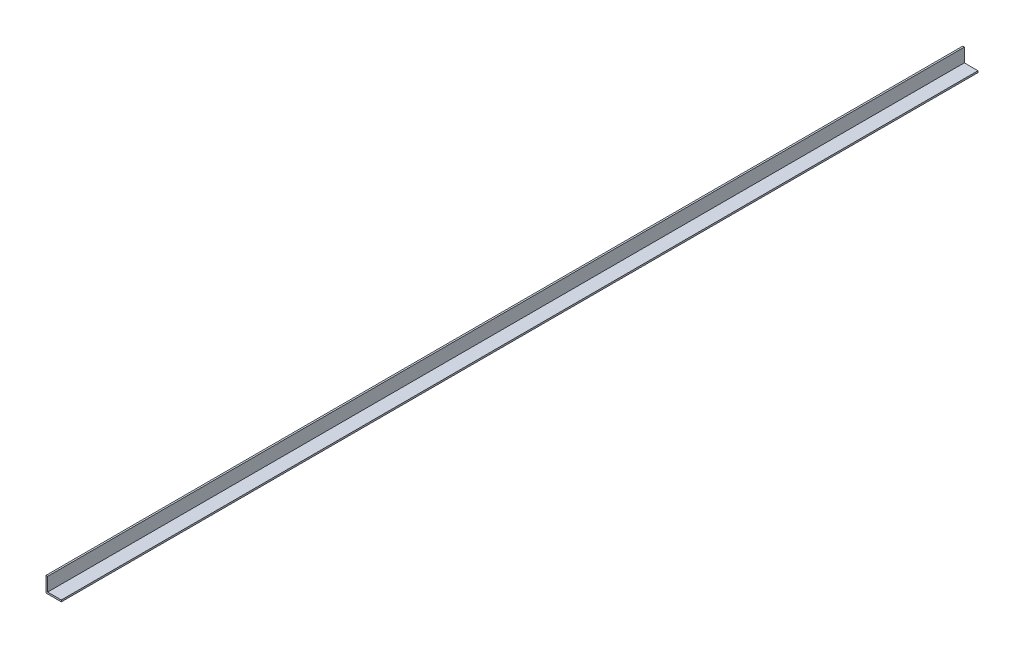
ISO-10303-21;
HEADER;
FILE_DESCRIPTION(('STEP AP214'),'2;1');
FILE_NAME('part.step','',(''),(''),'','','');
FILE_SCHEMA(('AUTOMOTIVE_DESIGN { 1 0 10303 214 1 1 1 1 }'));
ENDSEC;
DATA;
#1=APPLICATION_CONTEXT('core data for automotive mechanical design processes');
#2=APPLICATION_PROTOCOL_DEFINITION('international standard','automotive_design',2000,#1);
#3=PRODUCT_CONTEXT('',#1,'mechanical');
#4=PRODUCT('Part','Part','',(#3));
#5=PRODUCT_RELATED_PRODUCT_CATEGORY('part','',(#4));
#6=PRODUCT_DEFINITION_FORMATION('','',#4);
#7=PRODUCT_DEFINITION_CONTEXT('part definition',#1,'design');
#8=PRODUCT_DEFINITION('design','',#6,#7);
#9=PRODUCT_DEFINITION_SHAPE('','',#8);
#10=(LENGTH_UNIT() NAMED_UNIT(*) SI_UNIT(.MILLI.,.METRE.));
#11=(NAMED_UNIT(*) PLANE_ANGLE_UNIT() SI_UNIT($,.RADIAN.));
#12=(NAMED_UNIT(*) SI_UNIT($,.STERADIAN.) SOLID_ANGLE_UNIT());
#13=UNCERTAINTY_MEASURE_WITH_UNIT(LENGTH_MEASURE(1.E-05),#10,'distance_accuracy_value','');
#14=(GEOMETRIC_REPRESENTATION_CONTEXT(3) GLOBAL_UNCERTAINTY_ASSIGNED_CONTEXT((#13)) GLOBAL_UNIT_ASSIGNED_CONTEXT((#10,
#11,#12)) REPRESENTATION_CONTEXT('',''));
#15=CARTESIAN_POINT('',(0.,0.,0.));
#16=DIRECTION('',(0.,0.,1.));
#17=DIRECTION('',(1.,0.,0.));
#18=AXIS2_PLACEMENT_3D('',#15,#16,#17);
#19=CARTESIAN_POINT('',(11.1,102.,-6100.));
#20=DIRECTION('',(0.,1.,0.));
#21=DIRECTION('',(0.,0.,1.));
#22=AXIS2_PLACEMENT_3D('',#19,#20,#21);
#23=PLANE('',#22);
#24=DIRECTION('',(-1.,0.,0.));
#25=VECTOR('',#24,1.);
#26=CARTESIAN_POINT('',(11.1,102.,0.));
#27=LINE('',#26,#25);
#28=CARTESIAN_POINT('',(11.1,102.,0.));
#29=VERTEX_POINT('',#28);
#30=CARTESIAN_POINT('',(0.,102.,0.));
#31=VERTEX_POINT('',#30);
#32=EDGE_CURVE('E118',#29,#31,#27,.T.);
#33=ORIENTED_EDGE('',*,*,#32,.F.);
#34=DIRECTION('',(0.,0.,1.));
#35=VECTOR('',#34,1.);
#36=CARTESIAN_POINT('',(11.1,102.,-6100.));
#37=LINE('',#36,#35);
#38=CARTESIAN_POINT('',(11.1,102.,-6100.));
#39=VERTEX_POINT('',#38);
#40=EDGE_CURVE('E11',#39,#29,#37,.T.);
#41=ORIENTED_EDGE('',*,*,#40,.F.);
#42=DIRECTION('',(-1.,0.,0.));
#43=VECTOR('',#42,1.);
#44=CARTESIAN_POINT('',(11.1,102.,-6100.));
#45=LINE('',#44,#43);
#46=CARTESIAN_POINT('',(0.,102.,-6100.));
#47=VERTEX_POINT('',#46);
#48=EDGE_CURVE('E132',#39,#47,#45,.T.);
#49=ORIENTED_EDGE('',*,*,#48,.T.);
#50=DIRECTION('',(0.,0.,1.));
#51=VECTOR('',#50,1.);
#52=CARTESIAN_POINT('',(0.,102.,-6100.));
#53=LINE('',#52,#51);
#54=EDGE_CURVE('E36',#47,#31,#53,.T.);
#55=ORIENTED_EDGE('',*,*,#54,.T.);
#56=EDGE_LOOP('',(#33,#41,#49,#55));
#57=FACE_BOUND('',#56,.T.);
#58=ADVANCED_FACE('F33',(#57),#23,.T.);
#59=CARTESIAN_POINT('',(11.1,11.1,-6100.));
#60=DIRECTION('',(1.,0.,0.));
#61=DIRECTION('',(0.,1.,0.));
#62=AXIS2_PLACEMENT_3D('',#59,#60,#61);
#63=PLANE('',#62);
#64=DIRECTION('',(0.,1.,0.));
#65=VECTOR('',#64,1.);
#66=CARTESIAN_POINT('',(11.1,11.1,0.));
#67=LINE('',#66,#65);
#68=CARTESIAN_POINT('',(11.1,11.1,0.));
#69=VERTEX_POINT('',#68);
#70=EDGE_CURVE('E130',#69,#29,#67,.T.);
#71=ORIENTED_EDGE('',*,*,#70,.F.);
#72=DIRECTION('',(0.,0.,1.));
#73=VECTOR('',#72,1.);
#74=CARTESIAN_POINT('',(11.1,11.1,-6100.));
#75=LINE('',#74,#73);
#76=CARTESIAN_POINT('',(11.1,11.1,-6100.));
#77=VERTEX_POINT('',#76);
#78=EDGE_CURVE('E42',#77,#69,#75,.T.);
#79=ORIENTED_EDGE('',*,*,#78,.F.);
#80=DIRECTION('',(0.,1.,0.));
#81=VECTOR('',#80,1.);
#82=CARTESIAN_POINT('',(11.1,11.1,-6100.));
#83=LINE('',#82,#81);
#84=EDGE_CURVE('E108',#77,#39,#83,.T.);
#85=ORIENTED_EDGE('',*,*,#84,.T.);
#86=ORIENTED_EDGE('',*,*,#40,.T.);
#87=EDGE_LOOP('',(#71,#79,#85,#86));
#88=FACE_BOUND('',#87,.T.);
#89=ADVANCED_FACE('F140',(#88),#63,.T.);
#90=CARTESIAN_POINT('',(102.,11.1,-6100.));
#91=DIRECTION('',(0.,1.,0.));
#92=DIRECTION('',(-1.,0.,0.));
#93=AXIS2_PLACEMENT_3D('',#90,#91,#92);
#94=PLANE('',#93);
#95=DIRECTION('',(-1.,0.,0.));
#96=VECTOR('',#95,1.);
#97=CARTESIAN_POINT('',(102.,11.1,0.));
#98=LINE('',#97,#96);
#99=CARTESIAN_POINT('',(102.,11.1,0.));
#100=VERTEX_POINT('',#99);
#101=EDGE_CURVE('E95',#100,#69,#98,.T.);
#102=ORIENTED_EDGE('',*,*,#101,.F.);
#103=DIRECTION('',(0.,0.,1.));
#104=VECTOR('',#103,1.);
#105=CARTESIAN_POINT('',(102.,11.1,-6100.));
#106=LINE('',#105,#104);
#107=CARTESIAN_POINT('',(102.,11.1,-6100.));
#108=VERTEX_POINT('',#107);
#109=EDGE_CURVE('E90',#108,#100,#106,.T.);
#110=ORIENTED_EDGE('',*,*,#109,.F.);
#111=DIRECTION('',(-1.,0.,0.));
#112=VECTOR('',#111,1.);
#113=CARTESIAN_POINT('',(102.,11.1,-6100.));
#114=LINE('',#113,#112);
#115=EDGE_CURVE('E93',#108,#77,#114,.T.);
#116=ORIENTED_EDGE('',*,*,#115,.T.);
#117=ORIENTED_EDGE('',*,*,#78,.T.);
#118=EDGE_LOOP('',(#102,#110,#116,#117));
#119=FACE_BOUND('',#118,.T.);
#120=ADVANCED_FACE('F92',(#119),#94,.T.);
#121=CARTESIAN_POINT('',(102.,0.,-6100.));
#122=DIRECTION('',(1.,0.,0.));
#123=DIRECTION('',(0.,0.,-1.));
#124=AXIS2_PLACEMENT_3D('',#121,#122,#123);
#125=PLANE('',#124);
#126=DIRECTION('',(0.,1.,0.));
#127=VECTOR('',#126,1.);
#128=CARTESIAN_POINT('',(102.,0.,0.));
#129=LINE('',#128,#127);
#130=CARTESIAN_POINT('',(102.,0.,0.));
#131=VERTEX_POINT('',#130);
#132=EDGE_CURVE('E127',#131,#100,#129,.T.);
#133=ORIENTED_EDGE('',*,*,#132,.F.);
#134=DIRECTION('',(0.,0.,1.));
#135=VECTOR('',#134,1.);
#136=CARTESIAN_POINT('',(102.,0.,-6100.));
#137=LINE('',#136,#135);
#138=CARTESIAN_POINT('',(102.,0.,-6100.));
#139=VERTEX_POINT('',#138);
#140=EDGE_CURVE('E100',#139,#131,#137,.T.);
#141=ORIENTED_EDGE('',*,*,#140,.F.);
#142=DIRECTION('',(0.,1.,0.));
#143=VECTOR('',#142,1.);
#144=CARTESIAN_POINT('',(102.,0.,-6100.));
#145=LINE('',#144,#143);
#146=EDGE_CURVE('E106',#139,#108,#145,.T.);
#147=ORIENTED_EDGE('',*,*,#146,.T.);
#148=ORIENTED_EDGE('',*,*,#109,.T.);
#149=EDGE_LOOP('',(#133,#141,#147,#148));
#150=FACE_BOUND('',#149,.T.);
#151=ADVANCED_FACE('F110',(#150),#125,.T.);
#152=CARTESIAN_POINT('',(0.,0.,-6100.));
#153=DIRECTION('',(0.,-1.,0.));
#154=DIRECTION('',(0.,0.,-1.));
#155=AXIS2_PLACEMENT_3D('',#152,#153,#154);
#156=PLANE('',#155);
#157=DIRECTION('',(1.,0.,0.));
#158=VECTOR('',#157,1.);
#159=CARTESIAN_POINT('',(0.,0.,0.));
#160=LINE('',#159,#158);
#161=CARTESIAN_POINT('',(0.,0.,0.));
#162=VERTEX_POINT('',#161);
#163=EDGE_CURVE('E124',#162,#131,#160,.T.);
#164=ORIENTED_EDGE('',*,*,#163,.F.);
#165=DIRECTION('',(0.,0.,1.));
#166=VECTOR('',#165,1.);
#167=CARTESIAN_POINT('',(0.,0.,-6100.));
#168=LINE('',#167,#166);
#169=CARTESIAN_POINT('',(0.,0.,-6100.));
#170=VERTEX_POINT('',#169);
#171=EDGE_CURVE('E135',#170,#162,#168,.T.);
#172=ORIENTED_EDGE('',*,*,#171,.F.);
#173=DIRECTION('',(1.,0.,0.));
#174=VECTOR('',#173,1.);
#175=CARTESIAN_POINT('',(0.,0.,-6100.));
#176=LINE('',#175,#174);
#177=EDGE_CURVE('E111',#170,#139,#176,.T.);
#178=ORIENTED_EDGE('',*,*,#177,.T.);
#179=ORIENTED_EDGE('',*,*,#140,.T.);
#180=EDGE_LOOP('',(#164,#172,#178,#179));
#181=FACE_BOUND('',#180,.T.);
#182=ADVANCED_FACE('F153',(#181),#156,.T.);
#183=CARTESIAN_POINT('',(0.,102.,-6100.));
#184=DIRECTION('',(-1.,0.,0.));
#185=DIRECTION('',(0.,-1.,0.));
#186=AXIS2_PLACEMENT_3D('',#183,#184,#185);
#187=PLANE('',#186);
#188=DIRECTION('',(0.,-1.,0.));
#189=VECTOR('',#188,1.);
#190=CARTESIAN_POINT('',(0.,102.,0.));
#191=LINE('',#190,#189);
#192=EDGE_CURVE('E121',#31,#162,#191,.T.);
#193=ORIENTED_EDGE('',*,*,#192,.F.);
#194=ORIENTED_EDGE('',*,*,#54,.F.);
#195=DIRECTION('',(0.,-1.,0.));
#196=VECTOR('',#195,1.);
#197=CARTESIAN_POINT('',(0.,102.,-6100.));
#198=LINE('',#197,#196);
#199=EDGE_CURVE('E113',#47,#170,#198,.T.);
#200=ORIENTED_EDGE('',*,*,#199,.T.);
#201=ORIENTED_EDGE('',*,*,#171,.T.);
#202=EDGE_LOOP('',(#193,#194,#200,#201));
#203=FACE_BOUND('',#202,.T.);
#204=ADVANCED_FACE('F137',(#203),#187,.T.);
#205=CARTESIAN_POINT('',(0.,0.,-6100.));
#206=DIRECTION('',(0.,0.,1.));
#207=DIRECTION('',(1.,0.,0.));
#208=AXIS2_PLACEMENT_3D('',#205,#206,#207);
#209=PLANE('',#208);
#210=ORIENTED_EDGE('',*,*,#48,.F.);
#211=ORIENTED_EDGE('',*,*,#84,.F.);
#212=ORIENTED_EDGE('',*,*,#115,.F.);
#213=ORIENTED_EDGE('',*,*,#146,.F.);
#214=ORIENTED_EDGE('',*,*,#177,.F.);
#215=ORIENTED_EDGE('',*,*,#199,.F.);
#216=EDGE_LOOP('',(#210,#211,#212,#213,#214,#215));
#217=FACE_BOUND('',#216,.T.);
#218=ADVANCED_FACE('F104',(#217),#209,.F.);
#219=CARTESIAN_POINT('',(0.,0.,0.));
#220=DIRECTION('',(0.,0.,1.));
#221=DIRECTION('',(1.,0.,0.));
#222=AXIS2_PLACEMENT_3D('',#219,#220,#221);
#223=PLANE('',#222);
#224=ORIENTED_EDGE('',*,*,#32,.T.);
#225=ORIENTED_EDGE('',*,*,#192,.T.);
#226=ORIENTED_EDGE('',*,*,#163,.T.);
#227=ORIENTED_EDGE('',*,*,#132,.T.);
#228=ORIENTED_EDGE('',*,*,#101,.T.);
#229=ORIENTED_EDGE('',*,*,#70,.T.);
#230=EDGE_LOOP('',(#224,#225,#226,#227,#228,#229));
#231=FACE_BOUND('',#230,.T.);
#232=ADVANCED_FACE('F139',(#231),#223,.T.);
#233=CLOSED_SHELL('',(#58,#89,#120,#151,#182,#204,#218,#232));
#234=MANIFOLD_SOLID_BREP('B2',#233);
#235=ADVANCED_BREP_SHAPE_REPRESENTATION('',(#18,#234),#14);
#236=SHAPE_DEFINITION_REPRESENTATION(#9,#235);
ENDSEC;
END-ISO-10303-21;
